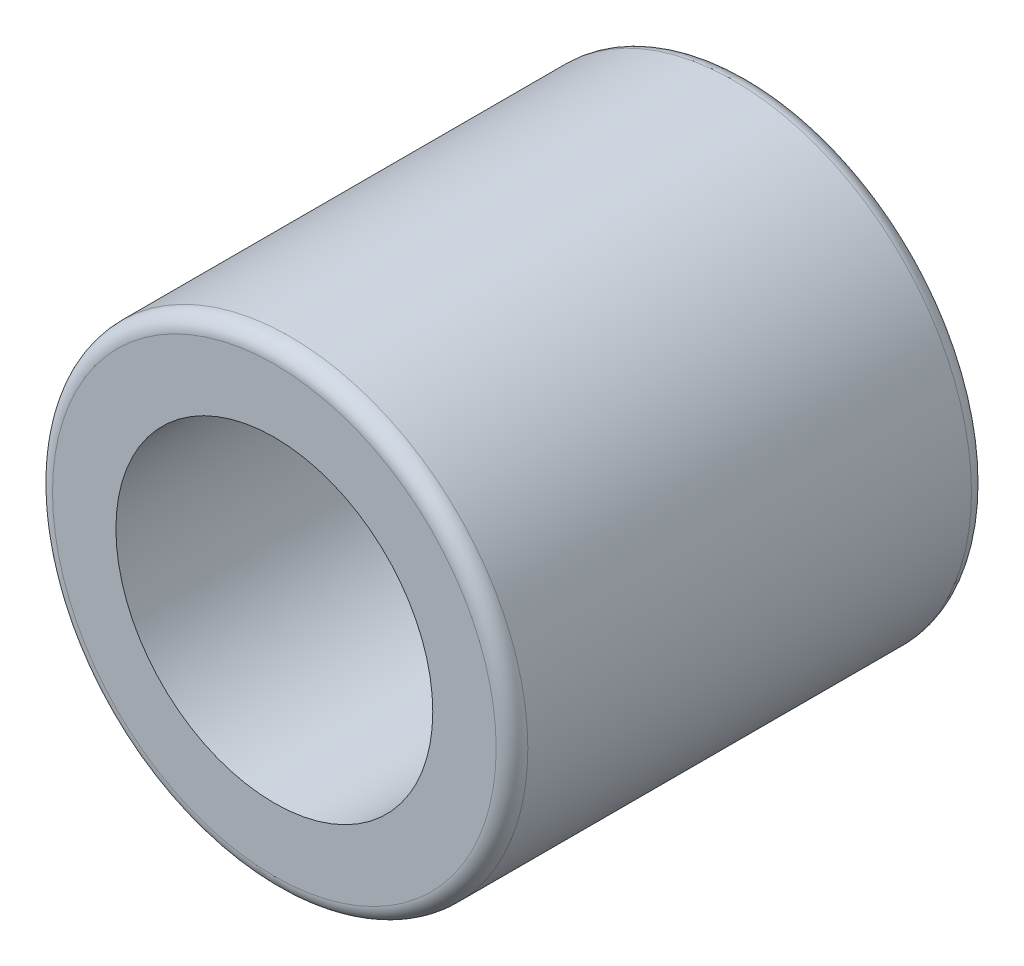
ISO-10303-21;
HEADER;
FILE_DESCRIPTION(('STEP AP214'),'2;1');
FILE_NAME('part.step','',(''),(''),'','','');
FILE_SCHEMA(('AUTOMOTIVE_DESIGN { 1 0 10303 214 1 1 1 1 }'));
ENDSEC;
DATA;
#1=APPLICATION_CONTEXT('core data for automotive mechanical design processes');
#2=APPLICATION_PROTOCOL_DEFINITION('international standard','automotive_design',2000,#1);
#3=PRODUCT_CONTEXT('',#1,'mechanical');
#4=PRODUCT('Part','Part','',(#3));
#5=PRODUCT_RELATED_PRODUCT_CATEGORY('part','',(#4));
#6=PRODUCT_DEFINITION_FORMATION('','',#4);
#7=PRODUCT_DEFINITION_CONTEXT('part definition',#1,'design');
#8=PRODUCT_DEFINITION('design','',#6,#7);
#9=PRODUCT_DEFINITION_SHAPE('','',#8);
#10=(LENGTH_UNIT() NAMED_UNIT(*) SI_UNIT(.MILLI.,.METRE.));
#11=(NAMED_UNIT(*) PLANE_ANGLE_UNIT() SI_UNIT($,.RADIAN.));
#12=(NAMED_UNIT(*) SI_UNIT($,.STERADIAN.) SOLID_ANGLE_UNIT());
#13=UNCERTAINTY_MEASURE_WITH_UNIT(LENGTH_MEASURE(1.E-05),#10,'distance_accuracy_value','');
#14=(GEOMETRIC_REPRESENTATION_CONTEXT(3) GLOBAL_UNCERTAINTY_ASSIGNED_CONTEXT((#13)) GLOBAL_UNIT_ASSIGNED_CONTEXT((#10,
#11,#12)) REPRESENTATION_CONTEXT('',''));
#15=CARTESIAN_POINT('',(0.,0.,0.));
#16=DIRECTION('',(0.,0.,1.));
#17=DIRECTION('',(1.,0.,0.));
#18=AXIS2_PLACEMENT_3D('',#15,#16,#17);
#19=CARTESIAN_POINT('',(0.,0.,15.));
#20=DIRECTION('',(0.,0.,1.));
#21=DIRECTION('',(1.,0.,0.));
#22=AXIS2_PLACEMENT_3D('',#19,#20,#21);
#23=PLANE('',#22);
#24=CARTESIAN_POINT('',(0.,0.,15.));
#25=DIRECTION('',(0.,0.,1.));
#26=DIRECTION('',(1.,0.,0.));
#27=AXIS2_PLACEMENT_3D('',#24,#25,#26);
#28=CIRCLE('',#27,14.);
#29=CARTESIAN_POINT('',(14.,0.,15.));
#30=VERTEX_POINT('',#29);
#31=EDGE_CURVE('E10',#30,#30,#28,.T.);
#32=ORIENTED_EDGE('',*,*,#31,.T.);
#33=EDGE_LOOP('',(#32));
#34=FACE_BOUND('',#33,.T.);
#35=CARTESIAN_POINT('',(0.,0.,15.));
#36=DIRECTION('',(0.,0.,1.));
#37=DIRECTION('',(1.,0.,0.));
#38=AXIS2_PLACEMENT_3D('',#35,#36,#37);
#39=CIRCLE('',#38,10.);
#40=CARTESIAN_POINT('',(10.,0.,15.));
#41=VERTEX_POINT('',#40);
#42=EDGE_CURVE('E60',#41,#41,#39,.T.);
#43=ORIENTED_EDGE('',*,*,#42,.F.);
#44=EDGE_LOOP('',(#43));
#45=FACE_BOUND('',#44,.T.);
#46=ADVANCED_FACE('F40',(#34,#45),#23,.T.);
#47=CARTESIAN_POINT('',(0.,0.,-15.));
#48=DIRECTION('',(0.,0.,1.));
#49=DIRECTION('',(1.,0.,0.));
#50=AXIS2_PLACEMENT_3D('',#47,#48,#49);
#51=PLANE('',#50);
#52=CARTESIAN_POINT('',(0.,0.,-15.));
#53=DIRECTION('',(0.,0.,1.));
#54=DIRECTION('',(1.,0.,0.));
#55=AXIS2_PLACEMENT_3D('',#52,#53,#54);
#56=CIRCLE('',#55,14.);
#57=CARTESIAN_POINT('',(14.,0.,-15.));
#58=VERTEX_POINT('',#57);
#59=EDGE_CURVE('E42',#58,#58,#56,.F.);
#60=ORIENTED_EDGE('',*,*,#59,.T.);
#61=EDGE_LOOP('',(#60));
#62=FACE_BOUND('',#61,.T.);
#63=CARTESIAN_POINT('',(0.,0.,-15.));
#64=DIRECTION('',(0.,0.,1.));
#65=DIRECTION('',(1.,0.,0.));
#66=AXIS2_PLACEMENT_3D('',#63,#64,#65);
#67=CIRCLE('',#66,10.);
#68=CARTESIAN_POINT('',(10.,0.,-15.));
#69=VERTEX_POINT('',#68);
#70=EDGE_CURVE('E59',#69,#69,#67,.T.);
#71=ORIENTED_EDGE('',*,*,#70,.T.);
#72=EDGE_LOOP('',(#71));
#73=FACE_BOUND('',#72,.T.);
#74=ADVANCED_FACE('F67',(#62,#73),#51,.F.);
#75=CARTESIAN_POINT('',(0.,0.,15.));
#76=DIRECTION('',(0.,0.,-1.));
#77=DIRECTION('',(-1.,0.,0.));
#78=AXIS2_PLACEMENT_3D('',#75,#76,#77);
#79=CYLINDRICAL_SURFACE('',#78,15.);
#80=CARTESIAN_POINT('',(0.,0.,-14.));
#81=DIRECTION('',(0.,0.,1.));
#82=DIRECTION('',(1.,0.,0.));
#83=AXIS2_PLACEMENT_3D('',#80,#81,#82);
#84=CIRCLE('',#83,15.);
#85=CARTESIAN_POINT('',(15.,0.,-14.));
#86=VERTEX_POINT('',#85);
#87=EDGE_CURVE('E48',#86,#86,#84,.T.);
#88=ORIENTED_EDGE('',*,*,#87,.T.);
#89=EDGE_LOOP('',(#88));
#90=FACE_BOUND('',#89,.T.);
#91=CARTESIAN_POINT('',(0.,0.,14.));
#92=DIRECTION('',(0.,0.,1.));
#93=DIRECTION('',(1.,0.,0.));
#94=AXIS2_PLACEMENT_3D('',#91,#92,#93);
#95=CIRCLE('',#94,15.);
#96=CARTESIAN_POINT('',(15.,0.,14.));
#97=VERTEX_POINT('',#96);
#98=EDGE_CURVE('E55',#97,#97,#95,.F.);
#99=ORIENTED_EDGE('',*,*,#98,.T.);
#100=EDGE_LOOP('',(#99));
#101=FACE_BOUND('',#100,.T.);
#102=ADVANCED_FACE('F74',(#90,#101),#79,.T.);
#103=CARTESIAN_POINT('',(0.,0.,15.));
#104=DIRECTION('',(0.,0.,-1.));
#105=DIRECTION('',(-1.,0.,0.));
#106=AXIS2_PLACEMENT_3D('',#103,#104,#105);
#107=CYLINDRICAL_SURFACE('',#106,10.);
#108=ORIENTED_EDGE('',*,*,#42,.T.);
#109=EDGE_LOOP('',(#108));
#110=FACE_BOUND('',#109,.T.);
#111=ORIENTED_EDGE('',*,*,#70,.F.);
#112=EDGE_LOOP('',(#111));
#113=FACE_BOUND('',#112,.T.);
#114=ADVANCED_FACE('F61',(#110,#113),#107,.F.);
#115=CARTESIAN_POINT('',(0.,0.,-14.));
#116=DIRECTION('',(0.,0.,1.));
#117=DIRECTION('',(1.,0.,0.));
#118=AXIS2_PLACEMENT_3D('',#115,#116,#117);
#119=TOROIDAL_SURFACE('',#118,14.,1.);
#120=ORIENTED_EDGE('',*,*,#59,.F.);
#121=EDGE_LOOP('',(#120));
#122=FACE_BOUND('',#121,.T.);
#123=ORIENTED_EDGE('',*,*,#87,.F.);
#124=EDGE_LOOP('',(#123));
#125=FACE_BOUND('',#124,.T.);
#126=ADVANCED_FACE('F78',(#122,#125),#119,.T.);
#127=CARTESIAN_POINT('',(0.,0.,14.));
#128=DIRECTION('',(0.,0.,1.));
#129=DIRECTION('',(1.,0.,0.));
#130=AXIS2_PLACEMENT_3D('',#127,#128,#129);
#131=TOROIDAL_SURFACE('',#130,14.,1.);
#132=ORIENTED_EDGE('',*,*,#98,.F.);
#133=EDGE_LOOP('',(#132));
#134=FACE_BOUND('',#133,.T.);
#135=ORIENTED_EDGE('',*,*,#31,.F.);
#136=EDGE_LOOP('',(#135));
#137=FACE_BOUND('',#136,.T.);
#138=ADVANCED_FACE('F39',(#134,#137),#131,.T.);
#139=CLOSED_SHELL('',(#46,#74,#102,#114,#126,#138));
#140=MANIFOLD_SOLID_BREP('B2',#139);
#141=ADVANCED_BREP_SHAPE_REPRESENTATION('',(#18,#140),#14);
#142=SHAPE_DEFINITION_REPRESENTATION(#9,#141);
ENDSEC;
END-ISO-10303-21;
